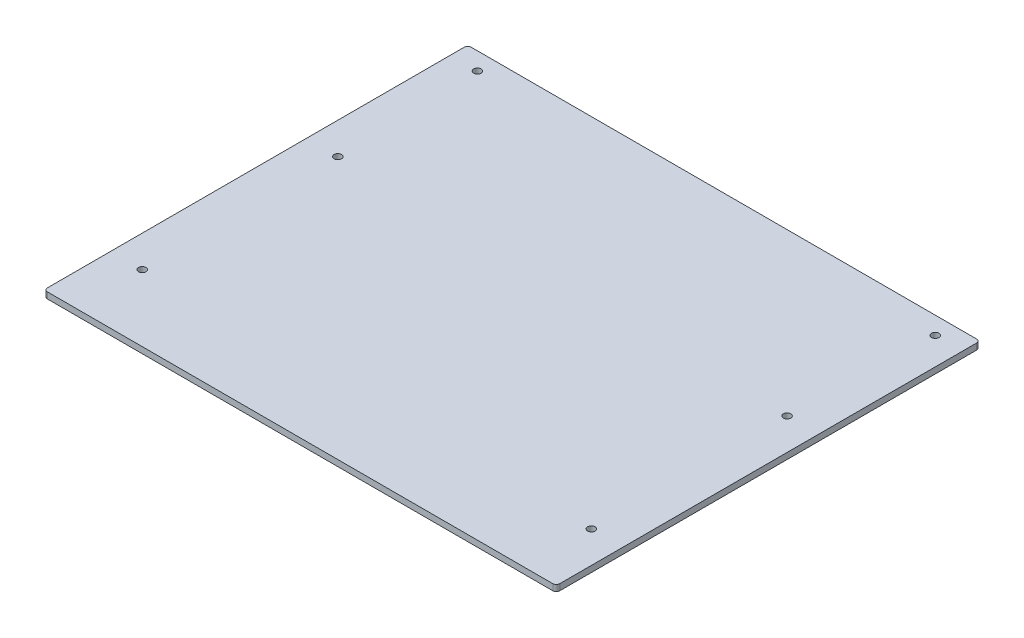
ISO-10303-21;
HEADER;
FILE_DESCRIPTION(('STEP AP214'),'2;1');
FILE_NAME('part.step','',(''),(''),'','','');
FILE_SCHEMA(('AUTOMOTIVE_DESIGN { 1 0 10303 214 1 1 1 1 }'));
ENDSEC;
DATA;
#1=APPLICATION_CONTEXT('core data for automotive mechanical design processes');
#2=APPLICATION_PROTOCOL_DEFINITION('international standard','automotive_design',2000,#1);
#3=PRODUCT_CONTEXT('',#1,'mechanical');
#4=PRODUCT('Part','Part','',(#3));
#5=PRODUCT_RELATED_PRODUCT_CATEGORY('part','',(#4));
#6=PRODUCT_DEFINITION_FORMATION('','',#4);
#7=PRODUCT_DEFINITION_CONTEXT('part definition',#1,'design');
#8=PRODUCT_DEFINITION('design','',#6,#7);
#9=PRODUCT_DEFINITION_SHAPE('','',#8);
#10=(LENGTH_UNIT() NAMED_UNIT(*) SI_UNIT(.MILLI.,.METRE.));
#11=(NAMED_UNIT(*) PLANE_ANGLE_UNIT() SI_UNIT($,.RADIAN.));
#12=(NAMED_UNIT(*) SI_UNIT($,.STERADIAN.) SOLID_ANGLE_UNIT());
#13=UNCERTAINTY_MEASURE_WITH_UNIT(LENGTH_MEASURE(1.E-05),#10,'distance_accuracy_value','');
#14=(GEOMETRIC_REPRESENTATION_CONTEXT(3) GLOBAL_UNCERTAINTY_ASSIGNED_CONTEXT((#13)) GLOBAL_UNIT_ASSIGNED_CONTEXT((#10,
#11,#12)) REPRESENTATION_CONTEXT('',''));
#15=CARTESIAN_POINT('',(0.,0.,0.));
#16=DIRECTION('',(0.,0.,1.));
#17=DIRECTION('',(1.,0.,0.));
#18=AXIS2_PLACEMENT_3D('',#15,#16,#17);
#19=CARTESIAN_POINT('',(0.,5.588,0.));
#20=DIRECTION('',(0.,-1.,0.));
#21=DIRECTION('',(0.,0.,-1.));
#22=AXIS2_PLACEMENT_3D('',#19,#20,#21);
#23=PLANE('',#22);
#24=CARTESIAN_POINT('',(24.638,5.588,-367.538));
#25=DIRECTION('',(0.,1.,0.));
#26=DIRECTION('',(0.,0.,1.));
#27=AXIS2_PLACEMENT_3D('',#24,#25,#26);
#28=CIRCLE('',#27,3.37819999999999);
#29=CARTESIAN_POINT('',(24.638,5.588,-364.1598));
#30=VERTEX_POINT('',#29);
#31=EDGE_CURVE('E212',#30,#30,#28,.T.);
#32=ORIENTED_EDGE('',*,*,#31,.F.);
#33=EDGE_LOOP('',(#32));
#34=FACE_BOUND('',#33,.T.);
#35=CARTESIAN_POINT('',(438.912,5.588,-367.538));
#36=DIRECTION('',(0.,1.,0.));
#37=DIRECTION('',(0.,0.,-1.));
#38=AXIS2_PLACEMENT_3D('',#35,#36,#37);
#39=CIRCLE('',#38,3.37819999999999);
#40=CARTESIAN_POINT('',(438.912,5.588,-370.9162));
#41=VERTEX_POINT('',#40);
#42=EDGE_CURVE('E206',#41,#41,#39,.T.);
#43=ORIENTED_EDGE('',*,*,#42,.F.);
#44=EDGE_LOOP('',(#43));
#45=FACE_BOUND('',#44,.T.);
#46=DIRECTION('',(-1.,0.,0.));
#47=VECTOR('',#46,1.);
#48=CARTESIAN_POINT('',(0.,5.588,-383.413));
#49=LINE('',#48,#47);
#50=CARTESIAN_POINT('',(460.375,5.588,-383.413));
#51=VERTEX_POINT('',#50);
#52=CARTESIAN_POINT('',(3.175,5.588,-383.413));
#53=VERTEX_POINT('',#52);
#54=EDGE_CURVE('E138',#51,#53,#49,.T.);
#55=ORIENTED_EDGE('',*,*,#54,.T.);
#56=CARTESIAN_POINT('',(3.175,5.588,-380.238));
#57=DIRECTION('',(0.,-1.,0.));
#58=DIRECTION('',(0.,0.,-1.));
#59=AXIS2_PLACEMENT_3D('',#56,#57,#58);
#60=CIRCLE('',#59,3.175);
#61=CARTESIAN_POINT('',(0.,5.588,-380.238));
#62=VERTEX_POINT('',#61);
#63=EDGE_CURVE('E156',#53,#62,#60,.F.);
#64=ORIENTED_EDGE('',*,*,#63,.T.);
#65=DIRECTION('',(0.,0.,1.));
#66=VECTOR('',#65,1.);
#67=CARTESIAN_POINT('',(0.,5.588,0.));
#68=LINE('',#67,#66);
#69=CARTESIAN_POINT('',(0.,5.588,-3.175));
#70=VERTEX_POINT('',#69);
#71=EDGE_CURVE('E120',#62,#70,#68,.T.);
#72=ORIENTED_EDGE('',*,*,#71,.T.);
#73=CARTESIAN_POINT('',(3.175,5.588,-3.175));
#74=DIRECTION('',(0.,-1.,0.));
#75=DIRECTION('',(0.,0.,-1.));
#76=AXIS2_PLACEMENT_3D('',#73,#74,#75);
#77=CIRCLE('',#76,3.175);
#78=CARTESIAN_POINT('',(3.175,5.588,0.));
#79=VERTEX_POINT('',#78);
#80=EDGE_CURVE('E152',#70,#79,#77,.F.);
#81=ORIENTED_EDGE('',*,*,#80,.T.);
#82=DIRECTION('',(1.,0.,0.));
#83=VECTOR('',#82,1.);
#84=CARTESIAN_POINT('',(0.,5.588,0.));
#85=LINE('',#84,#83);
#86=CARTESIAN_POINT('',(460.375,5.588,0.));
#87=VERTEX_POINT('',#86);
#88=EDGE_CURVE('E165',#79,#87,#85,.T.);
#89=ORIENTED_EDGE('',*,*,#88,.T.);
#90=CARTESIAN_POINT('',(460.375,5.588,-3.175));
#91=DIRECTION('',(0.,-1.,0.));
#92=DIRECTION('',(0.,0.,-1.));
#93=AXIS2_PLACEMENT_3D('',#90,#91,#92);
#94=CIRCLE('',#93,3.175);
#95=CARTESIAN_POINT('',(463.55,5.588,-3.175));
#96=VERTEX_POINT('',#95);
#97=EDGE_CURVE('E55',#87,#96,#94,.F.);
#98=ORIENTED_EDGE('',*,*,#97,.T.);
#99=DIRECTION('',(0.,0.,-1.));
#100=VECTOR('',#99,1.);
#101=CARTESIAN_POINT('',(463.55,5.588,0.));
#102=LINE('',#101,#100);
#103=CARTESIAN_POINT('',(463.55,5.588,-380.238));
#104=VERTEX_POINT('',#103);
#105=EDGE_CURVE('E171',#96,#104,#102,.T.);
#106=ORIENTED_EDGE('',*,*,#105,.T.);
#107=CARTESIAN_POINT('',(460.375,5.588,-380.238));
#108=DIRECTION('',(0.,-1.,0.));
#109=DIRECTION('',(0.,0.,-1.));
#110=AXIS2_PLACEMENT_3D('',#107,#108,#109);
#111=CIRCLE('',#110,3.175);
#112=EDGE_CURVE('E154',#104,#51,#111,.F.);
#113=ORIENTED_EDGE('',*,*,#112,.T.);
#114=EDGE_LOOP('',(#55,#64,#72,#81,#89,#98,#106,#113));
#115=FACE_BOUND('',#114,.T.);
#116=CARTESIAN_POINT('',(28.575,5.588,-60.325));
#117=DIRECTION('',(0.,1.,0.));
#118=DIRECTION('',(0.,0.,1.));
#119=AXIS2_PLACEMENT_3D('',#116,#117,#118);
#120=CIRCLE('',#119,3.37820000000001);
#121=CARTESIAN_POINT('',(28.575,5.588,-56.9468));
#122=VERTEX_POINT('',#121);
#123=EDGE_CURVE('E129',#122,#122,#120,.T.);
#124=ORIENTED_EDGE('',*,*,#123,.F.);
#125=EDGE_LOOP('',(#124));
#126=FACE_BOUND('',#125,.T.);
#127=CARTESIAN_POINT('',(28.575,5.588,-237.363));
#128=DIRECTION('',(0.,1.,0.));
#129=DIRECTION('',(0.,0.,1.));
#130=AXIS2_PLACEMENT_3D('',#127,#128,#129);
#131=CIRCLE('',#130,3.37819999999999);
#132=CARTESIAN_POINT('',(28.575,5.588,-233.9848));
#133=VERTEX_POINT('',#132);
#134=EDGE_CURVE('E186',#133,#133,#131,.T.);
#135=ORIENTED_EDGE('',*,*,#134,.F.);
#136=EDGE_LOOP('',(#135));
#137=FACE_BOUND('',#136,.T.);
#138=CARTESIAN_POINT('',(434.975,5.588,-237.363));
#139=DIRECTION('',(0.,1.,0.));
#140=DIRECTION('',(0.,0.,-1.));
#141=AXIS2_PLACEMENT_3D('',#138,#139,#140);
#142=CIRCLE('',#141,3.37819999999999);
#143=CARTESIAN_POINT('',(434.975,5.588,-240.7412));
#144=VERTEX_POINT('',#143);
#145=EDGE_CURVE('E191',#144,#144,#142,.T.);
#146=ORIENTED_EDGE('',*,*,#145,.F.);
#147=EDGE_LOOP('',(#146));
#148=FACE_BOUND('',#147,.T.);
#149=CARTESIAN_POINT('',(434.975,5.588,-60.325));
#150=DIRECTION('',(0.,1.,0.));
#151=DIRECTION('',(0.,0.,-1.));
#152=AXIS2_PLACEMENT_3D('',#149,#150,#151);
#153=CIRCLE('',#152,3.37819999999999);
#154=CARTESIAN_POINT('',(434.975,5.588,-63.7032));
#155=VERTEX_POINT('',#154);
#156=EDGE_CURVE('E197',#155,#155,#153,.T.);
#157=ORIENTED_EDGE('',*,*,#156,.F.);
#158=EDGE_LOOP('',(#157));
#159=FACE_BOUND('',#158,.T.);
#160=ADVANCED_FACE('F33',(#34,#45,#115,#126,#137,#148,#159),#23,.F.);
#161=CARTESIAN_POINT('',(0.,0.,0.));
#162=DIRECTION('',(0.,-1.,0.));
#163=DIRECTION('',(0.,0.,-1.));
#164=AXIS2_PLACEMENT_3D('',#161,#162,#163);
#165=PLANE('',#164);
#166=CARTESIAN_POINT('',(24.638,0.,-367.538));
#167=DIRECTION('',(0.,1.,0.));
#168=DIRECTION('',(0.,0.,1.));
#169=AXIS2_PLACEMENT_3D('',#166,#167,#168);
#170=CIRCLE('',#169,3.37819999999999);
#171=CARTESIAN_POINT('',(24.638,0.,-364.1598));
#172=VERTEX_POINT('',#171);
#173=EDGE_CURVE('E203',#172,#172,#170,.T.);
#174=ORIENTED_EDGE('',*,*,#173,.T.);
#175=EDGE_LOOP('',(#174));
#176=FACE_BOUND('',#175,.T.);
#177=CARTESIAN_POINT('',(438.912,0.,-367.538));
#178=DIRECTION('',(0.,1.,0.));
#179=DIRECTION('',(0.,0.,-1.));
#180=AXIS2_PLACEMENT_3D('',#177,#178,#179);
#181=CIRCLE('',#180,3.37819999999999);
#182=CARTESIAN_POINT('',(438.912,0.,-370.9162));
#183=VERTEX_POINT('',#182);
#184=EDGE_CURVE('E209',#183,#183,#181,.T.);
#185=ORIENTED_EDGE('',*,*,#184,.T.);
#186=EDGE_LOOP('',(#185));
#187=FACE_BOUND('',#186,.T.);
#188=CARTESIAN_POINT('',(434.975,0.,-237.363));
#189=DIRECTION('',(0.,1.,0.));
#190=DIRECTION('',(0.,0.,-1.));
#191=AXIS2_PLACEMENT_3D('',#188,#189,#190);
#192=CIRCLE('',#191,3.37819999999999);
#193=CARTESIAN_POINT('',(434.975,0.,-240.7412));
#194=VERTEX_POINT('',#193);
#195=EDGE_CURVE('E194',#194,#194,#192,.T.);
#196=ORIENTED_EDGE('',*,*,#195,.T.);
#197=EDGE_LOOP('',(#196));
#198=FACE_BOUND('',#197,.T.);
#199=CARTESIAN_POINT('',(28.575,0.,-60.325));
#200=DIRECTION('',(0.,1.,0.));
#201=DIRECTION('',(0.,0.,1.));
#202=AXIS2_PLACEMENT_3D('',#199,#200,#201);
#203=CIRCLE('',#202,3.37820000000001);
#204=CARTESIAN_POINT('',(28.575,0.,-56.9468));
#205=VERTEX_POINT('',#204);
#206=EDGE_CURVE('E135',#205,#205,#203,.T.);
#207=ORIENTED_EDGE('',*,*,#206,.T.);
#208=EDGE_LOOP('',(#207));
#209=FACE_BOUND('',#208,.T.);
#210=DIRECTION('',(0.,0.,1.));
#211=VECTOR('',#210,1.);
#212=CARTESIAN_POINT('',(0.,0.,0.));
#213=LINE('',#212,#211);
#214=CARTESIAN_POINT('',(0.,0.,-380.238));
#215=VERTEX_POINT('',#214);
#216=CARTESIAN_POINT('',(0.,0.,-3.175));
#217=VERTEX_POINT('',#216);
#218=EDGE_CURVE('E117',#215,#217,#213,.T.);
#219=ORIENTED_EDGE('',*,*,#218,.F.);
#220=CARTESIAN_POINT('',(3.175,0.,-380.238));
#221=DIRECTION('',(0.,-1.,0.));
#222=DIRECTION('',(0.,0.,-1.));
#223=AXIS2_PLACEMENT_3D('',#220,#221,#222);
#224=CIRCLE('',#223,3.175);
#225=CARTESIAN_POINT('',(3.175,0.,-383.413));
#226=VERTEX_POINT('',#225);
#227=EDGE_CURVE('E100',#215,#226,#224,.T.);
#228=ORIENTED_EDGE('',*,*,#227,.T.);
#229=DIRECTION('',(-1.,0.,0.));
#230=VECTOR('',#229,1.);
#231=CARTESIAN_POINT('',(0.,0.,-383.413));
#232=LINE('',#231,#230);
#233=CARTESIAN_POINT('',(460.375,0.,-383.413));
#234=VERTEX_POINT('',#233);
#235=EDGE_CURVE('E142',#234,#226,#232,.T.);
#236=ORIENTED_EDGE('',*,*,#235,.F.);
#237=CARTESIAN_POINT('',(460.375,0.,-380.238));
#238=DIRECTION('',(0.,-1.,0.));
#239=DIRECTION('',(0.,0.,-1.));
#240=AXIS2_PLACEMENT_3D('',#237,#238,#239);
#241=CIRCLE('',#240,3.175);
#242=CARTESIAN_POINT('',(463.55,0.,-380.238));
#243=VERTEX_POINT('',#242);
#244=EDGE_CURVE('E111',#234,#243,#241,.T.);
#245=ORIENTED_EDGE('',*,*,#244,.T.);
#246=DIRECTION('',(0.,0.,-1.));
#247=VECTOR('',#246,1.);
#248=CARTESIAN_POINT('',(463.55,0.,0.));
#249=LINE('',#248,#247);
#250=CARTESIAN_POINT('',(463.55,0.,-3.175));
#251=VERTEX_POINT('',#250);
#252=EDGE_CURVE('E132',#251,#243,#249,.T.);
#253=ORIENTED_EDGE('',*,*,#252,.F.);
#254=CARTESIAN_POINT('',(460.375,0.,-3.175));
#255=DIRECTION('',(0.,-1.,0.));
#256=DIRECTION('',(0.,0.,-1.));
#257=AXIS2_PLACEMENT_3D('',#254,#255,#256);
#258=CIRCLE('',#257,3.175);
#259=CARTESIAN_POINT('',(460.375,0.,0.));
#260=VERTEX_POINT('',#259);
#261=EDGE_CURVE('E121',#251,#260,#258,.T.);
#262=ORIENTED_EDGE('',*,*,#261,.T.);
#263=DIRECTION('',(1.,0.,0.));
#264=VECTOR('',#263,1.);
#265=CARTESIAN_POINT('',(0.,0.,0.));
#266=LINE('',#265,#264);
#267=CARTESIAN_POINT('',(3.175,0.,0.));
#268=VERTEX_POINT('',#267);
#269=EDGE_CURVE('E128',#268,#260,#266,.T.);
#270=ORIENTED_EDGE('',*,*,#269,.F.);
#271=CARTESIAN_POINT('',(3.175,0.,-3.175));
#272=DIRECTION('',(0.,-1.,0.));
#273=DIRECTION('',(0.,0.,-1.));
#274=AXIS2_PLACEMENT_3D('',#271,#272,#273);
#275=CIRCLE('',#274,3.175);
#276=EDGE_CURVE('E127',#268,#217,#275,.T.);
#277=ORIENTED_EDGE('',*,*,#276,.T.);
#278=EDGE_LOOP('',(#219,#228,#236,#245,#253,#262,#270,#277));
#279=FACE_BOUND('',#278,.T.);
#280=CARTESIAN_POINT('',(28.575,0.,-237.363));
#281=DIRECTION('',(0.,1.,0.));
#282=DIRECTION('',(0.,0.,1.));
#283=AXIS2_PLACEMENT_3D('',#280,#281,#282);
#284=CIRCLE('',#283,3.37819999999999);
#285=CARTESIAN_POINT('',(28.575,0.,-233.9848));
#286=VERTEX_POINT('',#285);
#287=EDGE_CURVE('E188',#286,#286,#284,.T.);
#288=ORIENTED_EDGE('',*,*,#287,.T.);
#289=EDGE_LOOP('',(#288));
#290=FACE_BOUND('',#289,.T.);
#291=CARTESIAN_POINT('',(434.975,0.,-60.325));
#292=DIRECTION('',(0.,1.,0.));
#293=DIRECTION('',(0.,0.,-1.));
#294=AXIS2_PLACEMENT_3D('',#291,#292,#293);
#295=CIRCLE('',#294,3.37819999999999);
#296=CARTESIAN_POINT('',(434.975,0.,-63.7032));
#297=VERTEX_POINT('',#296);
#298=EDGE_CURVE('E200',#297,#297,#295,.T.);
#299=ORIENTED_EDGE('',*,*,#298,.T.);
#300=EDGE_LOOP('',(#299));
#301=FACE_BOUND('',#300,.T.);
#302=ADVANCED_FACE('F124',(#176,#187,#198,#209,#279,#290,#301),#165,.T.);
#303=CARTESIAN_POINT('',(0.,5.588,0.));
#304=DIRECTION('',(1.,0.,0.));
#305=DIRECTION('',(0.,0.,-1.));
#306=AXIS2_PLACEMENT_3D('',#303,#304,#305);
#307=PLANE('',#306);
#308=ORIENTED_EDGE('',*,*,#71,.F.);
#309=DIRECTION('',(0.,-1.,0.));
#310=VECTOR('',#309,1.);
#311=CARTESIAN_POINT('',(0.,5.588,-380.238));
#312=LINE('',#311,#310);
#313=EDGE_CURVE('E104',#62,#215,#312,.T.);
#314=ORIENTED_EDGE('',*,*,#313,.T.);
#315=ORIENTED_EDGE('',*,*,#218,.T.);
#316=DIRECTION('',(0.,-1.,0.));
#317=VECTOR('',#316,1.);
#318=CARTESIAN_POINT('',(0.,5.588,-3.175));
#319=LINE('',#318,#317);
#320=EDGE_CURVE('E122',#217,#70,#319,.F.);
#321=ORIENTED_EDGE('',*,*,#320,.T.);
#322=EDGE_LOOP('',(#308,#314,#315,#321));
#323=FACE_BOUND('',#322,.T.);
#324=ADVANCED_FACE('F116',(#323),#307,.F.);
#325=CARTESIAN_POINT('',(0.,5.588,0.));
#326=DIRECTION('',(0.,0.,-1.));
#327=DIRECTION('',(-1.,0.,0.));
#328=AXIS2_PLACEMENT_3D('',#325,#326,#327);
#329=PLANE('',#328);
#330=ORIENTED_EDGE('',*,*,#88,.F.);
#331=DIRECTION('',(0.,-1.,0.));
#332=VECTOR('',#331,1.);
#333=CARTESIAN_POINT('',(3.175,5.588,0.));
#334=LINE('',#333,#332);
#335=EDGE_CURVE('E11',#79,#268,#334,.T.);
#336=ORIENTED_EDGE('',*,*,#335,.T.);
#337=ORIENTED_EDGE('',*,*,#269,.T.);
#338=DIRECTION('',(0.,-1.,0.));
#339=VECTOR('',#338,1.);
#340=CARTESIAN_POINT('',(460.375,5.588,0.));
#341=LINE('',#340,#339);
#342=EDGE_CURVE('E41',#260,#87,#341,.F.);
#343=ORIENTED_EDGE('',*,*,#342,.T.);
#344=EDGE_LOOP('',(#330,#336,#337,#343));
#345=FACE_BOUND('',#344,.T.);
#346=ADVANCED_FACE('F164',(#345),#329,.F.);
#347=CARTESIAN_POINT('',(463.55,5.588,0.));
#348=DIRECTION('',(-1.,0.,0.));
#349=DIRECTION('',(0.,0.,1.));
#350=AXIS2_PLACEMENT_3D('',#347,#348,#349);
#351=PLANE('',#350);
#352=ORIENTED_EDGE('',*,*,#252,.T.);
#353=DIRECTION('',(0.,-1.,0.));
#354=VECTOR('',#353,1.);
#355=CARTESIAN_POINT('',(463.55,5.588,-380.238));
#356=LINE('',#355,#354);
#357=EDGE_CURVE('E48',#243,#104,#356,.F.);
#358=ORIENTED_EDGE('',*,*,#357,.T.);
#359=ORIENTED_EDGE('',*,*,#105,.F.);
#360=DIRECTION('',(0.,-1.,0.));
#361=VECTOR('',#360,1.);
#362=CARTESIAN_POINT('',(463.55,5.588,-3.175));
#363=LINE('',#362,#361);
#364=EDGE_CURVE('E158',#96,#251,#363,.T.);
#365=ORIENTED_EDGE('',*,*,#364,.T.);
#366=EDGE_LOOP('',(#352,#358,#359,#365));
#367=FACE_BOUND('',#366,.T.);
#368=ADVANCED_FACE('F175',(#367),#351,.F.);
#369=CARTESIAN_POINT('',(0.,5.588,-383.413));
#370=DIRECTION('',(0.,0.,1.));
#371=DIRECTION('',(1.,0.,0.));
#372=AXIS2_PLACEMENT_3D('',#369,#370,#371);
#373=PLANE('',#372);
#374=ORIENTED_EDGE('',*,*,#235,.T.);
#375=DIRECTION('',(0.,-1.,0.));
#376=VECTOR('',#375,1.);
#377=CARTESIAN_POINT('',(3.175,5.588,-383.413));
#378=LINE('',#377,#376);
#379=EDGE_CURVE('E105',#226,#53,#378,.F.);
#380=ORIENTED_EDGE('',*,*,#379,.T.);
#381=ORIENTED_EDGE('',*,*,#54,.F.);
#382=DIRECTION('',(0.,-1.,0.));
#383=VECTOR('',#382,1.);
#384=CARTESIAN_POINT('',(460.375,5.588,-383.413));
#385=LINE('',#384,#383);
#386=EDGE_CURVE('E110',#51,#234,#385,.T.);
#387=ORIENTED_EDGE('',*,*,#386,.T.);
#388=EDGE_LOOP('',(#374,#380,#381,#387));
#389=FACE_BOUND('',#388,.T.);
#390=ADVANCED_FACE('F182',(#389),#373,.F.);
#391=CARTESIAN_POINT('',(28.575,5.588,-60.325));
#392=DIRECTION('',(0.,-1.,0.));
#393=DIRECTION('',(0.,0.,-1.));
#394=AXIS2_PLACEMENT_3D('',#391,#392,#393);
#395=CYLINDRICAL_SURFACE('',#394,3.37820000000001);
#396=ORIENTED_EDGE('',*,*,#123,.T.);
#397=EDGE_LOOP('',(#396));
#398=FACE_BOUND('',#397,.T.);
#399=ORIENTED_EDGE('',*,*,#206,.F.);
#400=EDGE_LOOP('',(#399));
#401=FACE_BOUND('',#400,.T.);
#402=ADVANCED_FACE('F252',(#398,#401),#395,.F.);
#403=CARTESIAN_POINT('',(28.575,5.588,-237.363));
#404=DIRECTION('',(0.,-1.,0.));
#405=DIRECTION('',(0.,0.,-1.));
#406=AXIS2_PLACEMENT_3D('',#403,#404,#405);
#407=CYLINDRICAL_SURFACE('',#406,3.37819999999999);
#408=ORIENTED_EDGE('',*,*,#134,.T.);
#409=EDGE_LOOP('',(#408));
#410=FACE_BOUND('',#409,.T.);
#411=ORIENTED_EDGE('',*,*,#287,.F.);
#412=EDGE_LOOP('',(#411));
#413=FACE_BOUND('',#412,.T.);
#414=ADVANCED_FACE('F248',(#410,#413),#407,.F.);
#415=CARTESIAN_POINT('',(434.975,5.588,-237.363));
#416=DIRECTION('',(0.,-1.,0.));
#417=DIRECTION('',(0.,0.,-1.));
#418=AXIS2_PLACEMENT_3D('',#415,#416,#417);
#419=CYLINDRICAL_SURFACE('',#418,3.37819999999999);
#420=ORIENTED_EDGE('',*,*,#145,.T.);
#421=EDGE_LOOP('',(#420));
#422=FACE_BOUND('',#421,.T.);
#423=ORIENTED_EDGE('',*,*,#195,.F.);
#424=EDGE_LOOP('',(#423));
#425=FACE_BOUND('',#424,.T.);
#426=ADVANCED_FACE('F244',(#422,#425),#419,.F.);
#427=CARTESIAN_POINT('',(434.975,5.588,-60.325));
#428=DIRECTION('',(0.,-1.,0.));
#429=DIRECTION('',(0.,0.,-1.));
#430=AXIS2_PLACEMENT_3D('',#427,#428,#429);
#431=CYLINDRICAL_SURFACE('',#430,3.37819999999999);
#432=ORIENTED_EDGE('',*,*,#156,.T.);
#433=EDGE_LOOP('',(#432));
#434=FACE_BOUND('',#433,.T.);
#435=ORIENTED_EDGE('',*,*,#298,.F.);
#436=EDGE_LOOP('',(#435));
#437=FACE_BOUND('',#436,.T.);
#438=ADVANCED_FACE('F241',(#434,#437),#431,.F.);
#439=CARTESIAN_POINT('',(3.175,5.588,-380.238));
#440=DIRECTION('',(0.,-1.,0.));
#441=DIRECTION('',(0.,0.,-1.));
#442=AXIS2_PLACEMENT_3D('',#439,#440,#441);
#443=CYLINDRICAL_SURFACE('',#442,3.175);
#444=ORIENTED_EDGE('',*,*,#63,.F.);
#445=ORIENTED_EDGE('',*,*,#379,.F.);
#446=ORIENTED_EDGE('',*,*,#227,.F.);
#447=ORIENTED_EDGE('',*,*,#313,.F.);
#448=EDGE_LOOP('',(#444,#445,#446,#447));
#449=FACE_BOUND('',#448,.T.);
#450=ADVANCED_FACE('F103',(#449),#443,.T.);
#451=CARTESIAN_POINT('',(460.375,5.588,-380.238));
#452=DIRECTION('',(0.,-1.,0.));
#453=DIRECTION('',(0.,0.,-1.));
#454=AXIS2_PLACEMENT_3D('',#451,#452,#453);
#455=CYLINDRICAL_SURFACE('',#454,3.175);
#456=ORIENTED_EDGE('',*,*,#112,.F.);
#457=ORIENTED_EDGE('',*,*,#357,.F.);
#458=ORIENTED_EDGE('',*,*,#244,.F.);
#459=ORIENTED_EDGE('',*,*,#386,.F.);
#460=EDGE_LOOP('',(#456,#457,#458,#459));
#461=FACE_BOUND('',#460,.T.);
#462=ADVANCED_FACE('F179',(#461),#455,.T.);
#463=CARTESIAN_POINT('',(3.175,5.588,-3.175));
#464=DIRECTION('',(0.,-1.,0.));
#465=DIRECTION('',(0.,0.,-1.));
#466=AXIS2_PLACEMENT_3D('',#463,#464,#465);
#467=CYLINDRICAL_SURFACE('',#466,3.175);
#468=ORIENTED_EDGE('',*,*,#80,.F.);
#469=ORIENTED_EDGE('',*,*,#320,.F.);
#470=ORIENTED_EDGE('',*,*,#276,.F.);
#471=ORIENTED_EDGE('',*,*,#335,.F.);
#472=EDGE_LOOP('',(#468,#469,#470,#471));
#473=FACE_BOUND('',#472,.T.);
#474=ADVANCED_FACE('F238',(#473),#467,.T.);
#475=CARTESIAN_POINT('',(460.375,5.588,-3.175));
#476=DIRECTION('',(0.,-1.,0.));
#477=DIRECTION('',(0.,0.,-1.));
#478=AXIS2_PLACEMENT_3D('',#475,#476,#477);
#479=CYLINDRICAL_SURFACE('',#478,3.175);
#480=ORIENTED_EDGE('',*,*,#97,.F.);
#481=ORIENTED_EDGE('',*,*,#342,.F.);
#482=ORIENTED_EDGE('',*,*,#261,.F.);
#483=ORIENTED_EDGE('',*,*,#364,.F.);
#484=EDGE_LOOP('',(#480,#481,#482,#483));
#485=FACE_BOUND('',#484,.T.);
#486=ADVANCED_FACE('F35',(#485),#479,.T.);
#487=CARTESIAN_POINT('',(438.912,0.,-367.538));
#488=DIRECTION('',(0.,1.,0.));
#489=DIRECTION('',(0.,0.,1.));
#490=AXIS2_PLACEMENT_3D('',#487,#488,#489);
#491=CYLINDRICAL_SURFACE('',#490,3.37819999999999);
#492=ORIENTED_EDGE('',*,*,#184,.F.);
#493=EDGE_LOOP('',(#492));
#494=FACE_BOUND('',#493,.T.);
#495=ORIENTED_EDGE('',*,*,#42,.T.);
#496=EDGE_LOOP('',(#495));
#497=FACE_BOUND('',#496,.T.);
#498=ADVANCED_FACE('F223',(#494,#497),#491,.F.);
#499=CARTESIAN_POINT('',(24.638,0.,-367.538));
#500=DIRECTION('',(0.,1.,0.));
#501=DIRECTION('',(0.,0.,1.));
#502=AXIS2_PLACEMENT_3D('',#499,#500,#501);
#503=CYLINDRICAL_SURFACE('',#502,3.37819999999999);
#504=ORIENTED_EDGE('',*,*,#173,.F.);
#505=EDGE_LOOP('',(#504));
#506=FACE_BOUND('',#505,.T.);
#507=ORIENTED_EDGE('',*,*,#31,.T.);
#508=EDGE_LOOP('',(#507));
#509=FACE_BOUND('',#508,.T.);
#510=ADVANCED_FACE('F220',(#506,#509),#503,.F.);
#511=CLOSED_SHELL('',(#160,#302,#324,#346,#368,#390,#402,#414,#426,#438,#450,#462,#474,#486,
#498,#510));
#512=MANIFOLD_SOLID_BREP('B2',#511);
#513=ADVANCED_BREP_SHAPE_REPRESENTATION('',(#18,#512),#14);
#514=SHAPE_DEFINITION_REPRESENTATION(#9,#513);
ENDSEC;
END-ISO-10303-21;
